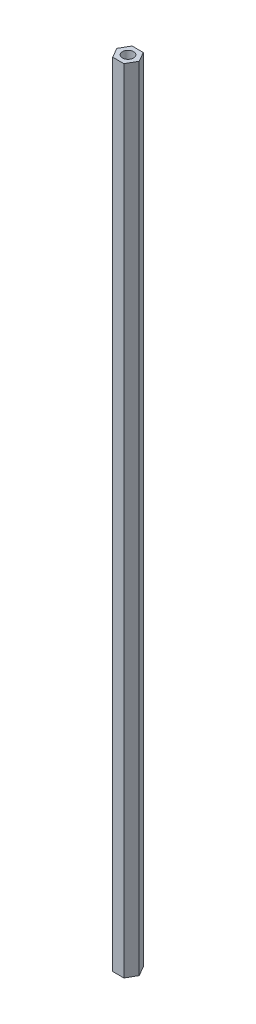
ISO-10303-21;
HEADER;
FILE_DESCRIPTION(('STEP AP214'),'2;1');
FILE_NAME('part.step','',(''),(''),'','','');
FILE_SCHEMA(('AUTOMOTIVE_DESIGN { 1 0 10303 214 1 1 1 1 }'));
ENDSEC;
DATA;
#1=APPLICATION_CONTEXT('core data for automotive mechanical design processes');
#2=APPLICATION_PROTOCOL_DEFINITION('international standard','automotive_design',2000,#1);
#3=PRODUCT_CONTEXT('',#1,'mechanical');
#4=PRODUCT('Part','Part','',(#3));
#5=PRODUCT_RELATED_PRODUCT_CATEGORY('part','',(#4));
#6=PRODUCT_DEFINITION_FORMATION('','',#4);
#7=PRODUCT_DEFINITION_CONTEXT('part definition',#1,'design');
#8=PRODUCT_DEFINITION('design','',#6,#7);
#9=PRODUCT_DEFINITION_SHAPE('','',#8);
#10=(LENGTH_UNIT() NAMED_UNIT(*) SI_UNIT(.MILLI.,.METRE.));
#11=(NAMED_UNIT(*) PLANE_ANGLE_UNIT() SI_UNIT($,.RADIAN.));
#12=(NAMED_UNIT(*) SI_UNIT($,.STERADIAN.) SOLID_ANGLE_UNIT());
#13=UNCERTAINTY_MEASURE_WITH_UNIT(LENGTH_MEASURE(1.E-05),#10,'distance_accuracy_value','');
#14=(GEOMETRIC_REPRESENTATION_CONTEXT(3) GLOBAL_UNCERTAINTY_ASSIGNED_CONTEXT((#13)) GLOBAL_UNIT_ASSIGNED_CONTEXT((#10,
#11,#12)) REPRESENTATION_CONTEXT('',''));
#15=CARTESIAN_POINT('',(0.,0.,0.));
#16=DIRECTION('',(0.,0.,1.));
#17=DIRECTION('',(1.,0.,0.));
#18=AXIS2_PLACEMENT_3D('',#15,#16,#17);
#19=CARTESIAN_POINT('',(0.,286.,0.));
#20=DIRECTION('',(0.,1.,0.));
#21=DIRECTION('',(0.,0.,1.));
#22=AXIS2_PLACEMENT_3D('',#19,#20,#21);
#23=PLANE('',#22);
#24=DIRECTION('',(-0.5,0.,-0.866025403784438));
#25=VECTOR('',#24,1.);
#26=CARTESIAN_POINT('',(4.04145188432738,286.,0.));
#27=LINE('',#26,#25);
#28=CARTESIAN_POINT('',(4.04145188432738,286.,0.));
#29=VERTEX_POINT('',#28);
#30=CARTESIAN_POINT('',(2.02072594216369,286.,-3.5));
#31=VERTEX_POINT('',#30);
#32=EDGE_CURVE('E154',#29,#31,#27,.T.);
#33=ORIENTED_EDGE('',*,*,#32,.T.);
#34=DIRECTION('',(-1.,0.,0.));
#35=VECTOR('',#34,1.);
#36=CARTESIAN_POINT('',(2.02072594216369,286.,-3.5));
#37=LINE('',#36,#35);
#38=CARTESIAN_POINT('',(-2.02072594216369,286.,-3.5));
#39=VERTEX_POINT('',#38);
#40=EDGE_CURVE('E102',#31,#39,#37,.T.);
#41=ORIENTED_EDGE('',*,*,#40,.T.);
#42=DIRECTION('',(-0.5,0.,0.866025403784439));
#43=VECTOR('',#42,1.);
#44=CARTESIAN_POINT('',(-2.02072594216369,286.,-3.5));
#45=LINE('',#44,#43);
#46=CARTESIAN_POINT('',(-4.04145188432738,286.,0.));
#47=VERTEX_POINT('',#46);
#48=EDGE_CURVE('E115',#39,#47,#45,.T.);
#49=ORIENTED_EDGE('',*,*,#48,.T.);
#50=DIRECTION('',(0.5,0.,0.866025403784439));
#51=VECTOR('',#50,1.);
#52=CARTESIAN_POINT('',(-4.04145188432738,286.,0.));
#53=LINE('',#52,#51);
#54=CARTESIAN_POINT('',(-2.02072594216368,286.,3.5));
#55=VERTEX_POINT('',#54);
#56=EDGE_CURVE('E109',#47,#55,#53,.T.);
#57=ORIENTED_EDGE('',*,*,#56,.T.);
#58=DIRECTION('',(1.,0.,0.));
#59=VECTOR('',#58,1.);
#60=CARTESIAN_POINT('',(-2.02072594216368,286.,3.5));
#61=LINE('',#60,#59);
#62=CARTESIAN_POINT('',(2.02072594216369,286.,3.5));
#63=VERTEX_POINT('',#62);
#64=EDGE_CURVE('E113',#55,#63,#61,.T.);
#65=ORIENTED_EDGE('',*,*,#64,.T.);
#66=DIRECTION('',(0.5,0.,-0.866025403784439));
#67=VECTOR('',#66,1.);
#68=CARTESIAN_POINT('',(2.02072594216369,286.,3.5));
#69=LINE('',#68,#67);
#70=EDGE_CURVE('E65',#63,#29,#69,.T.);
#71=ORIENTED_EDGE('',*,*,#70,.T.);
#72=EDGE_LOOP('',(#33,#41,#49,#57,#65,#71));
#73=FACE_BOUND('',#72,.T.);
#74=CARTESIAN_POINT('',(0.,286.,0.));
#75=DIRECTION('',(0.,1.,0.));
#76=DIRECTION('',(0.,0.,1.));
#77=AXIS2_PLACEMENT_3D('',#74,#75,#76);
#78=CIRCLE('',#77,2.);
#79=CARTESIAN_POINT('',(0.,286.,2.));
#80=VERTEX_POINT('',#79);
#81=EDGE_CURVE('E142',#80,#80,#78,.T.);
#82=ORIENTED_EDGE('',*,*,#81,.F.);
#83=EDGE_LOOP('',(#82));
#84=FACE_BOUND('',#83,.T.);
#85=ADVANCED_FACE('F47',(#73,#84),#23,.T.);
#86=CARTESIAN_POINT('',(0.,0.,0.));
#87=DIRECTION('',(0.,1.,0.));
#88=DIRECTION('',(0.,0.,1.));
#89=AXIS2_PLACEMENT_3D('',#86,#87,#88);
#90=PLANE('',#89);
#91=DIRECTION('',(-0.5,0.,-0.866025403784438));
#92=VECTOR('',#91,1.);
#93=CARTESIAN_POINT('',(4.04145188432738,0.,0.));
#94=LINE('',#93,#92);
#95=CARTESIAN_POINT('',(4.04145188432738,0.,0.));
#96=VERTEX_POINT('',#95);
#97=CARTESIAN_POINT('',(2.02072594216369,0.,-3.5));
#98=VERTEX_POINT('',#97);
#99=EDGE_CURVE('E137',#96,#98,#94,.T.);
#100=ORIENTED_EDGE('',*,*,#99,.F.);
#101=DIRECTION('',(0.5,0.,-0.866025403784439));
#102=VECTOR('',#101,1.);
#103=CARTESIAN_POINT('',(2.02072594216369,0.,3.5));
#104=LINE('',#103,#102);
#105=CARTESIAN_POINT('',(2.02072594216369,0.,3.5));
#106=VERTEX_POINT('',#105);
#107=EDGE_CURVE('E94',#106,#96,#104,.T.);
#108=ORIENTED_EDGE('',*,*,#107,.F.);
#109=DIRECTION('',(1.,0.,0.));
#110=VECTOR('',#109,1.);
#111=CARTESIAN_POINT('',(-2.02072594216368,0.,3.5));
#112=LINE('',#111,#110);
#113=CARTESIAN_POINT('',(-2.02072594216368,0.,3.5));
#114=VERTEX_POINT('',#113);
#115=EDGE_CURVE('E88',#114,#106,#112,.T.);
#116=ORIENTED_EDGE('',*,*,#115,.F.);
#117=DIRECTION('',(0.5,0.,0.866025403784439));
#118=VECTOR('',#117,1.);
#119=CARTESIAN_POINT('',(-4.04145188432738,0.,0.));
#120=LINE('',#119,#118);
#121=CARTESIAN_POINT('',(-4.04145188432738,0.,0.));
#122=VERTEX_POINT('',#121);
#123=EDGE_CURVE('E124',#122,#114,#120,.T.);
#124=ORIENTED_EDGE('',*,*,#123,.F.);
#125=DIRECTION('',(-0.5,0.,0.866025403784439));
#126=VECTOR('',#125,1.);
#127=CARTESIAN_POINT('',(-2.02072594216369,0.,-3.5));
#128=LINE('',#127,#126);
#129=CARTESIAN_POINT('',(-2.02072594216369,0.,-3.5));
#130=VERTEX_POINT('',#129);
#131=EDGE_CURVE('E145',#130,#122,#128,.T.);
#132=ORIENTED_EDGE('',*,*,#131,.F.);
#133=DIRECTION('',(-1.,0.,0.));
#134=VECTOR('',#133,1.);
#135=CARTESIAN_POINT('',(2.02072594216369,0.,-3.5));
#136=LINE('',#135,#134);
#137=EDGE_CURVE('E141',#98,#130,#136,.T.);
#138=ORIENTED_EDGE('',*,*,#137,.F.);
#139=EDGE_LOOP('',(#100,#108,#116,#124,#132,#138));
#140=FACE_BOUND('',#139,.T.);
#141=CARTESIAN_POINT('',(0.,0.,0.));
#142=DIRECTION('',(0.,1.,0.));
#143=DIRECTION('',(0.,0.,1.));
#144=AXIS2_PLACEMENT_3D('',#141,#142,#143);
#145=CIRCLE('',#144,2.);
#146=CARTESIAN_POINT('',(0.,0.,2.));
#147=VERTEX_POINT('',#146);
#148=EDGE_CURVE('E253',#147,#147,#145,.T.);
#149=ORIENTED_EDGE('',*,*,#148,.T.);
#150=EDGE_LOOP('',(#149));
#151=FACE_BOUND('',#150,.T.);
#152=ADVANCED_FACE('F167',(#140,#151),#90,.F.);
#153=CARTESIAN_POINT('',(4.04145188432738,286.,0.));
#154=DIRECTION('',(-0.866025403784438,0.,0.5));
#155=DIRECTION('',(0.5,0.,0.866025403784438));
#156=AXIS2_PLACEMENT_3D('',#153,#154,#155);
#157=PLANE('',#156);
#158=ORIENTED_EDGE('',*,*,#99,.T.);
#159=DIRECTION('',(0.,-1.,0.));
#160=VECTOR('',#159,1.);
#161=CARTESIAN_POINT('',(2.02072594216369,286.,-3.5));
#162=LINE('',#161,#160);
#163=EDGE_CURVE('E11',#31,#98,#162,.T.);
#164=ORIENTED_EDGE('',*,*,#163,.F.);
#165=ORIENTED_EDGE('',*,*,#32,.F.);
#166=DIRECTION('',(0.,-1.,0.));
#167=VECTOR('',#166,1.);
#168=CARTESIAN_POINT('',(4.04145188432738,286.,0.));
#169=LINE('',#168,#167);
#170=EDGE_CURVE('E133',#29,#96,#169,.T.);
#171=ORIENTED_EDGE('',*,*,#170,.T.);
#172=EDGE_LOOP('',(#158,#164,#165,#171));
#173=FACE_BOUND('',#172,.T.);
#174=ADVANCED_FACE('F49',(#173),#157,.F.);
#175=CARTESIAN_POINT('',(2.02072594216369,286.,-3.5));
#176=DIRECTION('',(0.,0.,1.));
#177=DIRECTION('',(1.,0.,0.));
#178=AXIS2_PLACEMENT_3D('',#175,#176,#177);
#179=PLANE('',#178);
#180=ORIENTED_EDGE('',*,*,#137,.T.);
#181=DIRECTION('',(0.,-1.,0.));
#182=VECTOR('',#181,1.);
#183=CARTESIAN_POINT('',(-2.02072594216369,286.,-3.5));
#184=LINE('',#183,#182);
#185=EDGE_CURVE('E57',#39,#130,#184,.T.);
#186=ORIENTED_EDGE('',*,*,#185,.F.);
#187=ORIENTED_EDGE('',*,*,#40,.F.);
#188=ORIENTED_EDGE('',*,*,#163,.T.);
#189=EDGE_LOOP('',(#180,#186,#187,#188));
#190=FACE_BOUND('',#189,.T.);
#191=ADVANCED_FACE('F192',(#190),#179,.F.);
#192=CARTESIAN_POINT('',(-2.02072594216369,286.,-3.5));
#193=DIRECTION('',(0.866025403784439,0.,0.5));
#194=DIRECTION('',(0.5,0.,-0.866025403784439));
#195=AXIS2_PLACEMENT_3D('',#192,#193,#194);
#196=PLANE('',#195);
#197=ORIENTED_EDGE('',*,*,#131,.T.);
#198=DIRECTION('',(0.,-1.,0.));
#199=VECTOR('',#198,1.);
#200=CARTESIAN_POINT('',(-4.04145188432738,286.,0.));
#201=LINE('',#200,#199);
#202=EDGE_CURVE('E126',#47,#122,#201,.T.);
#203=ORIENTED_EDGE('',*,*,#202,.F.);
#204=ORIENTED_EDGE('',*,*,#48,.F.);
#205=ORIENTED_EDGE('',*,*,#185,.T.);
#206=EDGE_LOOP('',(#197,#203,#204,#205));
#207=FACE_BOUND('',#206,.T.);
#208=ADVANCED_FACE('F164',(#207),#196,.F.);
#209=CARTESIAN_POINT('',(-4.04145188432738,286.,0.));
#210=DIRECTION('',(0.866025403784439,0.,-0.5));
#211=DIRECTION('',(-0.5,0.,-0.866025403784439));
#212=AXIS2_PLACEMENT_3D('',#209,#210,#211);
#213=PLANE('',#212);
#214=ORIENTED_EDGE('',*,*,#123,.T.);
#215=DIRECTION('',(0.,-1.,0.));
#216=VECTOR('',#215,1.);
#217=CARTESIAN_POINT('',(-2.02072594216368,286.,3.5));
#218=LINE('',#217,#216);
#219=EDGE_CURVE('E121',#55,#114,#218,.T.);
#220=ORIENTED_EDGE('',*,*,#219,.F.);
#221=ORIENTED_EDGE('',*,*,#56,.F.);
#222=ORIENTED_EDGE('',*,*,#202,.T.);
#223=EDGE_LOOP('',(#214,#220,#221,#222));
#224=FACE_BOUND('',#223,.T.);
#225=ADVANCED_FACE('F122',(#224),#213,.F.);
#226=CARTESIAN_POINT('',(-2.02072594216368,286.,3.5));
#227=DIRECTION('',(0.,0.,-1.));
#228=DIRECTION('',(-1.,0.,0.));
#229=AXIS2_PLACEMENT_3D('',#226,#227,#228);
#230=PLANE('',#229);
#231=ORIENTED_EDGE('',*,*,#115,.T.);
#232=DIRECTION('',(0.,-1.,0.));
#233=VECTOR('',#232,1.);
#234=CARTESIAN_POINT('',(2.02072594216369,286.,3.5));
#235=LINE('',#234,#233);
#236=EDGE_CURVE('E127',#63,#106,#235,.T.);
#237=ORIENTED_EDGE('',*,*,#236,.F.);
#238=ORIENTED_EDGE('',*,*,#64,.F.);
#239=ORIENTED_EDGE('',*,*,#219,.T.);
#240=EDGE_LOOP('',(#231,#237,#238,#239));
#241=FACE_BOUND('',#240,.T.);
#242=ADVANCED_FACE('F129',(#241),#230,.F.);
#243=CARTESIAN_POINT('',(2.02072594216369,286.,3.5));
#244=DIRECTION('',(-0.866025403784439,0.,-0.5));
#245=DIRECTION('',(-0.5,0.,0.866025403784439));
#246=AXIS2_PLACEMENT_3D('',#243,#244,#245);
#247=PLANE('',#246);
#248=ORIENTED_EDGE('',*,*,#107,.T.);
#249=ORIENTED_EDGE('',*,*,#170,.F.);
#250=ORIENTED_EDGE('',*,*,#70,.F.);
#251=ORIENTED_EDGE('',*,*,#236,.T.);
#252=EDGE_LOOP('',(#248,#249,#250,#251));
#253=FACE_BOUND('',#252,.T.);
#254=ADVANCED_FACE('F172',(#253),#247,.F.);
#255=CARTESIAN_POINT('',(0.,286.,0.));
#256=DIRECTION('',(0.,-1.,0.));
#257=DIRECTION('',(0.,0.,-1.));
#258=AXIS2_PLACEMENT_3D('',#255,#256,#257);
#259=CYLINDRICAL_SURFACE('',#258,2.);
#260=ORIENTED_EDGE('',*,*,#81,.T.);
#261=EDGE_LOOP('',(#260));
#262=FACE_BOUND('',#261,.T.);
#263=ORIENTED_EDGE('',*,*,#148,.F.);
#264=EDGE_LOOP('',(#263));
#265=FACE_BOUND('',#264,.T.);
#266=ADVANCED_FACE('F174',(#262,#265),#259,.F.);
#267=CLOSED_SHELL('',(#85,#152,#174,#191,#208,#225,#242,#254,#266));
#268=MANIFOLD_SOLID_BREP('B2',#267);
#269=ADVANCED_BREP_SHAPE_REPRESENTATION('',(#18,#268),#14);
#270=SHAPE_DEFINITION_REPRESENTATION(#9,#269);
ENDSEC;
END-ISO-10303-21;
